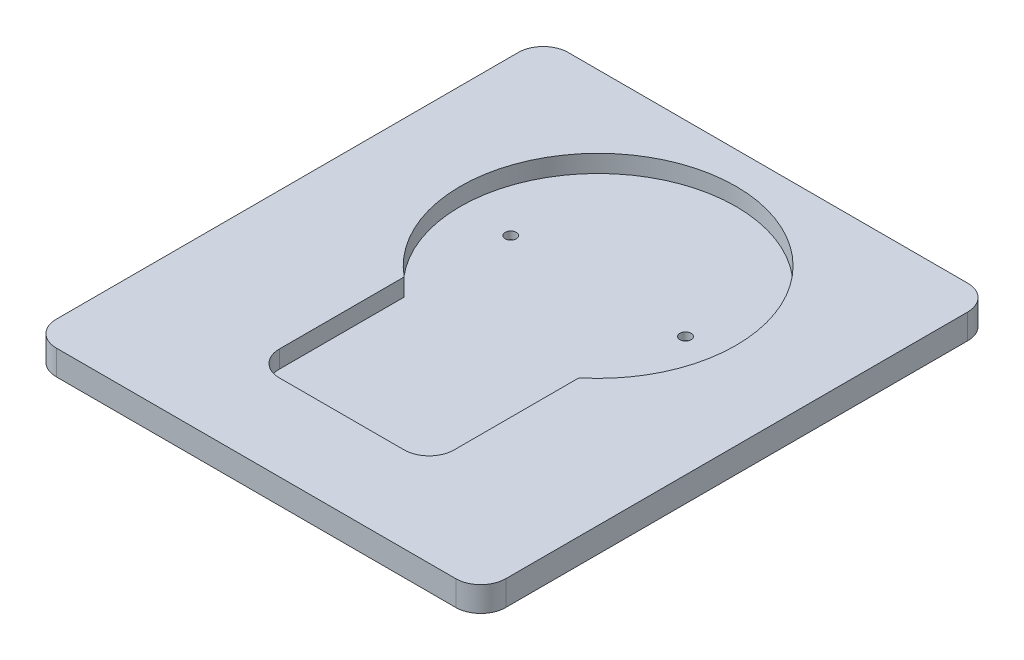
ISO-10303-21;
HEADER;
FILE_DESCRIPTION(('STEP AP214'),'2;1');
FILE_NAME('part.step','',(''),(''),'','','');
FILE_SCHEMA(('AUTOMOTIVE_DESIGN { 1 0 10303 214 1 1 1 1 }'));
ENDSEC;
DATA;
#1=APPLICATION_CONTEXT('core data for automotive mechanical design processes');
#2=APPLICATION_PROTOCOL_DEFINITION('international standard','automotive_design',2000,#1);
#3=PRODUCT_CONTEXT('',#1,'mechanical');
#4=PRODUCT('Part','Part','',(#3));
#5=PRODUCT_RELATED_PRODUCT_CATEGORY('part','',(#4));
#6=PRODUCT_DEFINITION_FORMATION('','',#4);
#7=PRODUCT_DEFINITION_CONTEXT('part definition',#1,'design');
#8=PRODUCT_DEFINITION('design','',#6,#7);
#9=PRODUCT_DEFINITION_SHAPE('','',#8);
#10=(LENGTH_UNIT() NAMED_UNIT(*) SI_UNIT(.MILLI.,.METRE.));
#11=(NAMED_UNIT(*) PLANE_ANGLE_UNIT() SI_UNIT($,.RADIAN.));
#12=(NAMED_UNIT(*) SI_UNIT($,.STERADIAN.) SOLID_ANGLE_UNIT());
#13=UNCERTAINTY_MEASURE_WITH_UNIT(LENGTH_MEASURE(1.E-05),#10,'distance_accuracy_value','');
#14=(GEOMETRIC_REPRESENTATION_CONTEXT(3) GLOBAL_UNCERTAINTY_ASSIGNED_CONTEXT((#13)) GLOBAL_UNIT_ASSIGNED_CONTEXT((#10,
#11,#12)) REPRESENTATION_CONTEXT('',''));
#15=CARTESIAN_POINT('',(0.,0.,0.));
#16=DIRECTION('',(0.,0.,1.));
#17=DIRECTION('',(1.,0.,0.));
#18=AXIS2_PLACEMENT_3D('',#15,#16,#17);
#19=CARTESIAN_POINT('',(80.,10.,-92.4999999999999));
#20=DIRECTION('',(0.,-1.,0.));
#21=DIRECTION('',(0.,0.,-1.));
#22=AXIS2_PLACEMENT_3D('',#19,#20,#21);
#23=CYLINDRICAL_SURFACE('',#22,10.);
#24=CARTESIAN_POINT('',(80.,0.,-92.4999999999999));
#25=DIRECTION('',(0.,1.,0.));
#26=DIRECTION('',(0.,0.,-1.));
#27=AXIS2_PLACEMENT_3D('',#24,#25,#26);
#28=CIRCLE('',#27,10.);
#29=CARTESIAN_POINT('',(90.,0.,-92.4999999999999));
#30=VERTEX_POINT('',#29);
#31=CARTESIAN_POINT('',(80.,0.,-102.5));
#32=VERTEX_POINT('',#31);
#33=EDGE_CURVE('E159',#30,#32,#28,.T.);
#34=ORIENTED_EDGE('',*,*,#33,.T.);
#35=DIRECTION('',(0.,-1.,0.));
#36=VECTOR('',#35,1.);
#37=CARTESIAN_POINT('',(80.,10.,-102.5));
#38=LINE('',#37,#36);
#39=CARTESIAN_POINT('',(80.,10.,-102.5));
#40=VERTEX_POINT('',#39);
#41=EDGE_CURVE('E11',#40,#32,#38,.T.);
#42=ORIENTED_EDGE('',*,*,#41,.F.);
#43=CARTESIAN_POINT('',(80.,10.,-92.4999999999999));
#44=DIRECTION('',(0.,1.,0.));
#45=DIRECTION('',(0.,0.,-1.));
#46=AXIS2_PLACEMENT_3D('',#43,#44,#45);
#47=CIRCLE('',#46,10.);
#48=CARTESIAN_POINT('',(90.,10.,-92.4999999999999));
#49=VERTEX_POINT('',#48);
#50=EDGE_CURVE('E183',#49,#40,#47,.T.);
#51=ORIENTED_EDGE('',*,*,#50,.F.);
#52=DIRECTION('',(0.,-1.,0.));
#53=VECTOR('',#52,1.);
#54=CARTESIAN_POINT('',(90.,10.,-92.4999999999999));
#55=LINE('',#54,#53);
#56=EDGE_CURVE('E155',#49,#30,#55,.T.);
#57=ORIENTED_EDGE('',*,*,#56,.T.);
#58=EDGE_LOOP('',(#34,#42,#51,#57));
#59=FACE_BOUND('',#58,.T.);
#60=ADVANCED_FACE('F43',(#59),#23,.T.);
#61=CARTESIAN_POINT('',(-80.,10.,-102.5));
#62=DIRECTION('',(0.,0.,1.));
#63=DIRECTION('',(1.,0.,0.));
#64=AXIS2_PLACEMENT_3D('',#61,#62,#63);
#65=PLANE('',#64);
#66=DIRECTION('',(-1.,0.,0.));
#67=VECTOR('',#66,1.);
#68=CARTESIAN_POINT('',(-80.,0.,-102.5));
#69=LINE('',#68,#67);
#70=CARTESIAN_POINT('',(-80.,0.,-102.5));
#71=VERTEX_POINT('',#70);
#72=EDGE_CURVE('E163',#32,#71,#69,.T.);
#73=ORIENTED_EDGE('',*,*,#72,.T.);
#74=DIRECTION('',(0.,-1.,0.));
#75=VECTOR('',#74,1.);
#76=CARTESIAN_POINT('',(-80.,10.,-102.5));
#77=LINE('',#76,#75);
#78=CARTESIAN_POINT('',(-80.,10.,-102.5));
#79=VERTEX_POINT('',#78);
#80=EDGE_CURVE('E52',#79,#71,#77,.T.);
#81=ORIENTED_EDGE('',*,*,#80,.F.);
#82=DIRECTION('',(-1.,0.,0.));
#83=VECTOR('',#82,1.);
#84=CARTESIAN_POINT('',(-80.,10.,-102.5));
#85=LINE('',#84,#83);
#86=EDGE_CURVE('E110',#40,#79,#85,.T.);
#87=ORIENTED_EDGE('',*,*,#86,.F.);
#88=ORIENTED_EDGE('',*,*,#41,.T.);
#89=EDGE_LOOP('',(#73,#81,#87,#88));
#90=FACE_BOUND('',#89,.T.);
#91=ADVANCED_FACE('F486',(#90),#65,.F.);
#92=CARTESIAN_POINT('',(-80.,10.,-92.4999999999999));
#93=DIRECTION('',(0.,-1.,0.));
#94=DIRECTION('',(0.,0.,-1.));
#95=AXIS2_PLACEMENT_3D('',#92,#93,#94);
#96=CYLINDRICAL_SURFACE('',#95,10.);
#97=CARTESIAN_POINT('',(-80.,0.,-92.4999999999999));
#98=DIRECTION('',(0.,1.,0.));
#99=DIRECTION('',(0.,0.,1.));
#100=AXIS2_PLACEMENT_3D('',#97,#98,#99);
#101=CIRCLE('',#100,10.);
#102=CARTESIAN_POINT('',(-90.,0.,-92.4999999999999));
#103=VERTEX_POINT('',#102);
#104=EDGE_CURVE('E167',#71,#103,#101,.T.);
#105=ORIENTED_EDGE('',*,*,#104,.T.);
#106=DIRECTION('',(0.,-1.,0.));
#107=VECTOR('',#106,1.);
#108=CARTESIAN_POINT('',(-90.,10.,-92.4999999999999));
#109=LINE('',#108,#107);
#110=CARTESIAN_POINT('',(-90.,10.,-92.4999999999999));
#111=VERTEX_POINT('',#110);
#112=EDGE_CURVE('E194',#111,#103,#109,.T.);
#113=ORIENTED_EDGE('',*,*,#112,.F.);
#114=CARTESIAN_POINT('',(-80.,10.,-92.4999999999999));
#115=DIRECTION('',(0.,1.,0.));
#116=DIRECTION('',(0.,0.,1.));
#117=AXIS2_PLACEMENT_3D('',#114,#115,#116);
#118=CIRCLE('',#117,10.);
#119=EDGE_CURVE('E290',#79,#111,#118,.T.);
#120=ORIENTED_EDGE('',*,*,#119,.F.);
#121=ORIENTED_EDGE('',*,*,#80,.T.);
#122=EDGE_LOOP('',(#105,#113,#120,#121));
#123=FACE_BOUND('',#122,.T.);
#124=ADVANCED_FACE('F478',(#123),#96,.T.);
#125=CARTESIAN_POINT('',(-90.,10.,-92.4999999999999));
#126=DIRECTION('',(1.,0.,0.));
#127=DIRECTION('',(0.,0.,-1.));
#128=AXIS2_PLACEMENT_3D('',#125,#126,#127);
#129=PLANE('',#128);
#130=DIRECTION('',(0.,0.,1.));
#131=VECTOR('',#130,1.);
#132=CARTESIAN_POINT('',(-90.,0.,-92.4999999999999));
#133=LINE('',#132,#131);
#134=CARTESIAN_POINT('',(-89.9999999999999,0.,92.5));
#135=VERTEX_POINT('',#134);
#136=EDGE_CURVE('E170',#103,#135,#133,.T.);
#137=ORIENTED_EDGE('',*,*,#136,.T.);
#138=DIRECTION('',(0.,-1.,0.));
#139=VECTOR('',#138,1.);
#140=CARTESIAN_POINT('',(-89.9999999999999,10.,92.5));
#141=LINE('',#140,#139);
#142=CARTESIAN_POINT('',(-89.9999999999999,10.,92.5));
#143=VERTEX_POINT('',#142);
#144=EDGE_CURVE('E190',#143,#135,#141,.T.);
#145=ORIENTED_EDGE('',*,*,#144,.F.);
#146=DIRECTION('',(0.,0.,1.));
#147=VECTOR('',#146,1.);
#148=CARTESIAN_POINT('',(-90.,10.,-92.4999999999999));
#149=LINE('',#148,#147);
#150=EDGE_CURVE('E293',#111,#143,#149,.T.);
#151=ORIENTED_EDGE('',*,*,#150,.F.);
#152=ORIENTED_EDGE('',*,*,#112,.T.);
#153=EDGE_LOOP('',(#137,#145,#151,#152));
#154=FACE_BOUND('',#153,.T.);
#155=ADVANCED_FACE('F470',(#154),#129,.F.);
#156=CARTESIAN_POINT('',(-80.,10.,92.5));
#157=DIRECTION('',(0.,-1.,0.));
#158=DIRECTION('',(0.,0.,-1.));
#159=AXIS2_PLACEMENT_3D('',#156,#157,#158);
#160=CYLINDRICAL_SURFACE('',#159,9.99999999999999);
#161=CARTESIAN_POINT('',(-80.,0.,92.5));
#162=DIRECTION('',(0.,1.,0.));
#163=DIRECTION('',(0.,0.,1.));
#164=AXIS2_PLACEMENT_3D('',#161,#162,#163);
#165=CIRCLE('',#164,9.99999999999999);
#166=CARTESIAN_POINT('',(-80.,0.,102.5));
#167=VERTEX_POINT('',#166);
#168=EDGE_CURVE('E173',#135,#167,#165,.T.);
#169=ORIENTED_EDGE('',*,*,#168,.T.);
#170=DIRECTION('',(0.,-1.,0.));
#171=VECTOR('',#170,1.);
#172=CARTESIAN_POINT('',(-80.,10.,102.5));
#173=LINE('',#172,#171);
#174=CARTESIAN_POINT('',(-80.,10.,102.5));
#175=VERTEX_POINT('',#174);
#176=EDGE_CURVE('E147',#175,#167,#173,.T.);
#177=ORIENTED_EDGE('',*,*,#176,.F.);
#178=CARTESIAN_POINT('',(-80.,10.,92.5));
#179=DIRECTION('',(0.,1.,0.));
#180=DIRECTION('',(0.,0.,1.));
#181=AXIS2_PLACEMENT_3D('',#178,#179,#180);
#182=CIRCLE('',#181,9.99999999999999);
#183=EDGE_CURVE('E133',#143,#175,#182,.T.);
#184=ORIENTED_EDGE('',*,*,#183,.F.);
#185=ORIENTED_EDGE('',*,*,#144,.T.);
#186=EDGE_LOOP('',(#169,#177,#184,#185));
#187=FACE_BOUND('',#186,.T.);
#188=ADVANCED_FACE('F463',(#187),#160,.T.);
#189=CARTESIAN_POINT('',(-80.,10.,102.5));
#190=DIRECTION('',(0.,0.,-1.));
#191=DIRECTION('',(-1.,0.,0.));
#192=AXIS2_PLACEMENT_3D('',#189,#190,#191);
#193=PLANE('',#192);
#194=DIRECTION('',(1.,0.,0.));
#195=VECTOR('',#194,1.);
#196=CARTESIAN_POINT('',(-80.,0.,102.5));
#197=LINE('',#196,#195);
#198=CARTESIAN_POINT('',(80.,0.,102.5));
#199=VERTEX_POINT('',#198);
#200=EDGE_CURVE('E143',#167,#199,#197,.T.);
#201=ORIENTED_EDGE('',*,*,#200,.T.);
#202=DIRECTION('',(0.,-1.,0.));
#203=VECTOR('',#202,1.);
#204=CARTESIAN_POINT('',(80.,10.,102.5));
#205=LINE('',#204,#203);
#206=CARTESIAN_POINT('',(80.,10.,102.5));
#207=VERTEX_POINT('',#206);
#208=EDGE_CURVE('E140',#207,#199,#205,.T.);
#209=ORIENTED_EDGE('',*,*,#208,.F.);
#210=DIRECTION('',(1.,0.,0.));
#211=VECTOR('',#210,1.);
#212=CARTESIAN_POINT('',(-80.,10.,102.5));
#213=LINE('',#212,#211);
#214=EDGE_CURVE('E126',#175,#207,#213,.T.);
#215=ORIENTED_EDGE('',*,*,#214,.F.);
#216=ORIENTED_EDGE('',*,*,#176,.T.);
#217=EDGE_LOOP('',(#201,#209,#215,#216));
#218=FACE_BOUND('',#217,.T.);
#219=ADVANCED_FACE('F141',(#218),#193,.F.);
#220=CARTESIAN_POINT('',(80.,10.,92.5));
#221=DIRECTION('',(0.,-1.,0.));
#222=DIRECTION('',(0.,0.,-1.));
#223=AXIS2_PLACEMENT_3D('',#220,#221,#222);
#224=CYLINDRICAL_SURFACE('',#223,10.);
#225=CARTESIAN_POINT('',(80.,0.,92.5));
#226=DIRECTION('',(0.,1.,0.));
#227=DIRECTION('',(0.,0.,1.));
#228=AXIS2_PLACEMENT_3D('',#225,#226,#227);
#229=CIRCLE('',#228,10.);
#230=CARTESIAN_POINT('',(90.,0.,92.5));
#231=VERTEX_POINT('',#230);
#232=EDGE_CURVE('E178',#199,#231,#229,.T.);
#233=ORIENTED_EDGE('',*,*,#232,.T.);
#234=DIRECTION('',(0.,-1.,0.));
#235=VECTOR('',#234,1.);
#236=CARTESIAN_POINT('',(90.,10.,92.5));
#237=LINE('',#236,#235);
#238=CARTESIAN_POINT('',(90.,10.,92.5));
#239=VERTEX_POINT('',#238);
#240=EDGE_CURVE('E148',#239,#231,#237,.T.);
#241=ORIENTED_EDGE('',*,*,#240,.F.);
#242=CARTESIAN_POINT('',(80.,10.,92.5));
#243=DIRECTION('',(0.,1.,0.));
#244=DIRECTION('',(0.,0.,1.));
#245=AXIS2_PLACEMENT_3D('',#242,#243,#244);
#246=CIRCLE('',#245,10.);
#247=EDGE_CURVE('E130',#207,#239,#246,.T.);
#248=ORIENTED_EDGE('',*,*,#247,.F.);
#249=ORIENTED_EDGE('',*,*,#208,.T.);
#250=EDGE_LOOP('',(#233,#241,#248,#249));
#251=FACE_BOUND('',#250,.T.);
#252=ADVANCED_FACE('F150',(#251),#224,.T.);
#253=CARTESIAN_POINT('',(90.,10.,-92.4999999999999));
#254=DIRECTION('',(-1.,0.,0.));
#255=DIRECTION('',(0.,0.,1.));
#256=AXIS2_PLACEMENT_3D('',#253,#254,#255);
#257=PLANE('',#256);
#258=DIRECTION('',(0.,0.,-1.));
#259=VECTOR('',#258,1.);
#260=CARTESIAN_POINT('',(90.,0.,-92.4999999999999));
#261=LINE('',#260,#259);
#262=EDGE_CURVE('E102',#231,#30,#261,.T.);
#263=ORIENTED_EDGE('',*,*,#262,.T.);
#264=ORIENTED_EDGE('',*,*,#56,.F.);
#265=DIRECTION('',(0.,0.,-1.));
#266=VECTOR('',#265,1.);
#267=CARTESIAN_POINT('',(90.,10.,-92.4999999999999));
#268=LINE('',#267,#266);
#269=EDGE_CURVE('E69',#239,#49,#268,.T.);
#270=ORIENTED_EDGE('',*,*,#269,.F.);
#271=ORIENTED_EDGE('',*,*,#240,.T.);
#272=EDGE_LOOP('',(#263,#264,#270,#271));
#273=FACE_BOUND('',#272,.T.);
#274=ADVANCED_FACE('F366',(#273),#257,.F.);
#275=CARTESIAN_POINT('',(80.,10.,-92.4999999999999));
#276=DIRECTION('',(0.,-1.,0.));
#277=DIRECTION('',(0.,0.,-1.));
#278=AXIS2_PLACEMENT_3D('',#275,#276,#277);
#279=PLANE('',#278);
#280=DIRECTION('',(0.,0.,1.));
#281=VECTOR('',#280,1.);
#282=CARTESIAN_POINT('',(-35.,10.,8.18536048811117));
#283=LINE('',#282,#281);
#284=CARTESIAN_POINT('',(-35.,10.,8.18536048811117));
#285=VERTEX_POINT('',#284);
#286=CARTESIAN_POINT('',(-35.,10.,58.1853604881112));
#287=VERTEX_POINT('',#286);
#288=EDGE_CURVE('E210',#285,#287,#283,.T.);
#289=ORIENTED_EDGE('',*,*,#288,.F.);
#290=CARTESIAN_POINT('',(0.,10.,-34.5));
#291=DIRECTION('',(0.,1.,0.));
#292=DIRECTION('',(0.,0.,1.));
#293=AXIS2_PLACEMENT_3D('',#290,#291,#292);
#294=CIRCLE('',#293,55.2);
#295=CARTESIAN_POINT('',(35.,10.,8.18536048811116));
#296=VERTEX_POINT('',#295);
#297=EDGE_CURVE('E60',#296,#285,#294,.T.);
#298=ORIENTED_EDGE('',*,*,#297,.F.);
#299=DIRECTION('',(0.,0.,-1.));
#300=VECTOR('',#299,1.);
#301=CARTESIAN_POINT('',(35.,10.,8.18536048811116));
#302=LINE('',#301,#300);
#303=CARTESIAN_POINT('',(35.,10.,58.1853604881112));
#304=VERTEX_POINT('',#303);
#305=EDGE_CURVE('E227',#304,#296,#302,.T.);
#306=ORIENTED_EDGE('',*,*,#305,.F.);
#307=CARTESIAN_POINT('',(25.,10.,58.1853604881112));
#308=DIRECTION('',(0.,1.,0.));
#309=DIRECTION('',(0.,0.,1.));
#310=AXIS2_PLACEMENT_3D('',#307,#308,#309);
#311=CIRCLE('',#310,10.);
#312=CARTESIAN_POINT('',(25.,10.,68.1853604881112));
#313=VERTEX_POINT('',#312);
#314=EDGE_CURVE('E259',#313,#304,#311,.T.);
#315=ORIENTED_EDGE('',*,*,#314,.F.);
#316=DIRECTION('',(1.,0.,0.));
#317=VECTOR('',#316,1.);
#318=CARTESIAN_POINT('',(-25.,10.,68.1853604881112));
#319=LINE('',#318,#317);
#320=CARTESIAN_POINT('',(-25.,10.,68.1853604881112));
#321=VERTEX_POINT('',#320);
#322=EDGE_CURVE('E255',#321,#313,#319,.T.);
#323=ORIENTED_EDGE('',*,*,#322,.F.);
#324=CARTESIAN_POINT('',(-25.,10.,58.1853604881112));
#325=DIRECTION('',(0.,1.,0.));
#326=DIRECTION('',(0.,0.,1.));
#327=AXIS2_PLACEMENT_3D('',#324,#325,#326);
#328=CIRCLE('',#327,10.);
#329=EDGE_CURVE('E251',#287,#321,#328,.T.);
#330=ORIENTED_EDGE('',*,*,#329,.F.);
#331=EDGE_LOOP('',(#289,#298,#306,#315,#323,#330));
#332=FACE_BOUND('',#331,.T.);
#333=ORIENTED_EDGE('',*,*,#50,.T.);
#334=ORIENTED_EDGE('',*,*,#86,.T.);
#335=ORIENTED_EDGE('',*,*,#119,.T.);
#336=ORIENTED_EDGE('',*,*,#150,.T.);
#337=ORIENTED_EDGE('',*,*,#183,.T.);
#338=ORIENTED_EDGE('',*,*,#214,.T.);
#339=ORIENTED_EDGE('',*,*,#247,.T.);
#340=ORIENTED_EDGE('',*,*,#269,.T.);
#341=EDGE_LOOP('',(#333,#334,#335,#336,#337,#338,#339,#340));
#342=FACE_BOUND('',#341,.T.);
#343=ADVANCED_FACE('F128',(#332,#342),#279,.F.);
#344=CARTESIAN_POINT('',(80.,0.,-92.4999999999999));
#345=DIRECTION('',(0.,-1.,0.));
#346=DIRECTION('',(0.,0.,-1.));
#347=AXIS2_PLACEMENT_3D('',#344,#345,#346);
#348=PLANE('',#347);
#349=CARTESIAN_POINT('',(35.,0.,-34.5));
#350=DIRECTION('',(0.,-1.,0.));
#351=DIRECTION('',(0.,0.,-1.));
#352=AXIS2_PLACEMENT_3D('',#349,#350,#351);
#353=CIRCLE('',#352,2.24999999999999);
#354=CARTESIAN_POINT('',(35.,0.,-36.75));
#355=VERTEX_POINT('',#354);
#356=EDGE_CURVE('E219',#355,#355,#353,.T.);
#357=ORIENTED_EDGE('',*,*,#356,.F.);
#358=EDGE_LOOP('',(#357));
#359=FACE_BOUND('',#358,.T.);
#360=CARTESIAN_POINT('',(-35.,0.,-34.5));
#361=DIRECTION('',(0.,-1.,0.));
#362=DIRECTION('',(0.,0.,-1.));
#363=AXIS2_PLACEMENT_3D('',#360,#361,#362);
#364=CIRCLE('',#363,2.24999999999999);
#365=CARTESIAN_POINT('',(-35.,0.,-36.75));
#366=VERTEX_POINT('',#365);
#367=EDGE_CURVE('E203',#366,#366,#364,.T.);
#368=ORIENTED_EDGE('',*,*,#367,.F.);
#369=EDGE_LOOP('',(#368));
#370=FACE_BOUND('',#369,.T.);
#371=ORIENTED_EDGE('',*,*,#33,.F.);
#372=ORIENTED_EDGE('',*,*,#262,.F.);
#373=ORIENTED_EDGE('',*,*,#232,.F.);
#374=ORIENTED_EDGE('',*,*,#200,.F.);
#375=ORIENTED_EDGE('',*,*,#168,.F.);
#376=ORIENTED_EDGE('',*,*,#136,.F.);
#377=ORIENTED_EDGE('',*,*,#104,.F.);
#378=ORIENTED_EDGE('',*,*,#72,.F.);
#379=EDGE_LOOP('',(#371,#372,#373,#374,#375,#376,#377,#378));
#380=FACE_BOUND('',#379,.T.);
#381=ADVANCED_FACE('F365',(#359,#370,#380),#348,.T.);
#382=CARTESIAN_POINT('',(0.,3.,-34.5));
#383=DIRECTION('',(0.,1.,0.));
#384=DIRECTION('',(0.,0.,1.));
#385=AXIS2_PLACEMENT_3D('',#382,#383,#384);
#386=CYLINDRICAL_SURFACE('',#385,55.2);
#387=ORIENTED_EDGE('',*,*,#297,.T.);
#388=DIRECTION('',(0.,1.,0.));
#389=VECTOR('',#388,1.);
#390=CARTESIAN_POINT('',(-35.,3.,8.18536048811117));
#391=LINE('',#390,#389);
#392=CARTESIAN_POINT('',(-35.,3.,8.18536048811117));
#393=VERTEX_POINT('',#392);
#394=EDGE_CURVE('E246',#393,#285,#391,.T.);
#395=ORIENTED_EDGE('',*,*,#394,.F.);
#396=CARTESIAN_POINT('',(0.,3.,-34.5));
#397=DIRECTION('',(0.,1.,0.));
#398=DIRECTION('',(0.,0.,1.));
#399=AXIS2_PLACEMENT_3D('',#396,#397,#398);
#400=CIRCLE('',#399,55.2);
#401=CARTESIAN_POINT('',(35.,3.,8.18536048811116));
#402=VERTEX_POINT('',#401);
#403=EDGE_CURVE('E222',#402,#393,#400,.T.);
#404=ORIENTED_EDGE('',*,*,#403,.F.);
#405=DIRECTION('',(0.,1.,0.));
#406=VECTOR('',#405,1.);
#407=CARTESIAN_POINT('',(35.,3.,8.18536048811116));
#408=LINE('',#407,#406);
#409=EDGE_CURVE('E164',#402,#296,#408,.T.);
#410=ORIENTED_EDGE('',*,*,#409,.T.);
#411=EDGE_LOOP('',(#387,#395,#404,#410));
#412=FACE_BOUND('',#411,.T.);
#413=ADVANCED_FACE('F430',(#412),#386,.F.);
#414=CARTESIAN_POINT('',(35.,3.,8.18536048811116));
#415=DIRECTION('',(1.,0.,0.));
#416=DIRECTION('',(0.,0.,-1.));
#417=AXIS2_PLACEMENT_3D('',#414,#415,#416);
#418=PLANE('',#417);
#419=ORIENTED_EDGE('',*,*,#305,.T.);
#420=ORIENTED_EDGE('',*,*,#409,.F.);
#421=DIRECTION('',(0.,0.,-1.));
#422=VECTOR('',#421,1.);
#423=CARTESIAN_POINT('',(35.,3.,8.18536048811116));
#424=LINE('',#423,#422);
#425=CARTESIAN_POINT('',(35.,3.,58.1853604881112));
#426=VERTEX_POINT('',#425);
#427=EDGE_CURVE('E243',#426,#402,#424,.T.);
#428=ORIENTED_EDGE('',*,*,#427,.F.);
#429=DIRECTION('',(0.,1.,0.));
#430=VECTOR('',#429,1.);
#431=CARTESIAN_POINT('',(35.,3.,58.1853604881112));
#432=LINE('',#431,#430);
#433=EDGE_CURVE('E268',#426,#304,#432,.T.);
#434=ORIENTED_EDGE('',*,*,#433,.T.);
#435=EDGE_LOOP('',(#419,#420,#428,#434));
#436=FACE_BOUND('',#435,.T.);
#437=ADVANCED_FACE('F422',(#436),#418,.F.);
#438=CARTESIAN_POINT('',(25.,3.,58.1853604881112));
#439=DIRECTION('',(0.,1.,0.));
#440=DIRECTION('',(0.,0.,1.));
#441=AXIS2_PLACEMENT_3D('',#438,#439,#440);
#442=CYLINDRICAL_SURFACE('',#441,10.);
#443=ORIENTED_EDGE('',*,*,#314,.T.);
#444=ORIENTED_EDGE('',*,*,#433,.F.);
#445=CARTESIAN_POINT('',(25.,3.,58.1853604881112));
#446=DIRECTION('',(0.,1.,0.));
#447=DIRECTION('',(0.,0.,1.));
#448=AXIS2_PLACEMENT_3D('',#445,#446,#447);
#449=CIRCLE('',#448,10.);
#450=CARTESIAN_POINT('',(25.,3.,68.1853604881112));
#451=VERTEX_POINT('',#450);
#452=EDGE_CURVE('E239',#451,#426,#449,.T.);
#453=ORIENTED_EDGE('',*,*,#452,.F.);
#454=DIRECTION('',(0.,1.,0.));
#455=VECTOR('',#454,1.);
#456=CARTESIAN_POINT('',(25.,3.,68.1853604881112));
#457=LINE('',#456,#455);
#458=EDGE_CURVE('E272',#451,#313,#457,.T.);
#459=ORIENTED_EDGE('',*,*,#458,.T.);
#460=EDGE_LOOP('',(#443,#444,#453,#459));
#461=FACE_BOUND('',#460,.T.);
#462=ADVANCED_FACE('F414',(#461),#442,.F.);
#463=CARTESIAN_POINT('',(-25.,3.,68.1853604881112));
#464=DIRECTION('',(0.,0.,1.));
#465=DIRECTION('',(1.,0.,0.));
#466=AXIS2_PLACEMENT_3D('',#463,#464,#465);
#467=PLANE('',#466);
#468=ORIENTED_EDGE('',*,*,#322,.T.);
#469=ORIENTED_EDGE('',*,*,#458,.F.);
#470=DIRECTION('',(1.,0.,0.));
#471=VECTOR('',#470,1.);
#472=CARTESIAN_POINT('',(-25.,3.,68.1853604881112));
#473=LINE('',#472,#471);
#474=CARTESIAN_POINT('',(-25.,3.,68.1853604881112));
#475=VERTEX_POINT('',#474);
#476=EDGE_CURVE('E235',#475,#451,#473,.T.);
#477=ORIENTED_EDGE('',*,*,#476,.F.);
#478=DIRECTION('',(0.,1.,0.));
#479=VECTOR('',#478,1.);
#480=CARTESIAN_POINT('',(-25.,3.,68.1853604881112));
#481=LINE('',#480,#479);
#482=EDGE_CURVE('E276',#475,#321,#481,.T.);
#483=ORIENTED_EDGE('',*,*,#482,.T.);
#484=EDGE_LOOP('',(#468,#469,#477,#483));
#485=FACE_BOUND('',#484,.T.);
#486=ADVANCED_FACE('F406',(#485),#467,.F.);
#487=CARTESIAN_POINT('',(-25.,3.,58.1853604881112));
#488=DIRECTION('',(0.,1.,0.));
#489=DIRECTION('',(0.,0.,1.));
#490=AXIS2_PLACEMENT_3D('',#487,#488,#489);
#491=CYLINDRICAL_SURFACE('',#490,10.);
#492=ORIENTED_EDGE('',*,*,#329,.T.);
#493=ORIENTED_EDGE('',*,*,#482,.F.);
#494=CARTESIAN_POINT('',(-25.,3.,58.1853604881112));
#495=DIRECTION('',(0.,1.,0.));
#496=DIRECTION('',(0.,0.,1.));
#497=AXIS2_PLACEMENT_3D('',#494,#495,#496);
#498=CIRCLE('',#497,10.);
#499=CARTESIAN_POINT('',(-35.,3.,58.1853604881112));
#500=VERTEX_POINT('',#499);
#501=EDGE_CURVE('E231',#500,#475,#498,.T.);
#502=ORIENTED_EDGE('',*,*,#501,.F.);
#503=DIRECTION('',(0.,1.,0.));
#504=VECTOR('',#503,1.);
#505=CARTESIAN_POINT('',(-35.,3.,58.1853604881112));
#506=LINE('',#505,#504);
#507=EDGE_CURVE('E280',#500,#287,#506,.T.);
#508=ORIENTED_EDGE('',*,*,#507,.T.);
#509=EDGE_LOOP('',(#492,#493,#502,#508));
#510=FACE_BOUND('',#509,.T.);
#511=ADVANCED_FACE('F398',(#510),#491,.F.);
#512=CARTESIAN_POINT('',(-35.,3.,8.18536048811117));
#513=DIRECTION('',(-1.,0.,0.));
#514=DIRECTION('',(0.,0.,1.));
#515=AXIS2_PLACEMENT_3D('',#512,#513,#514);
#516=PLANE('',#515);
#517=ORIENTED_EDGE('',*,*,#288,.T.);
#518=ORIENTED_EDGE('',*,*,#507,.F.);
#519=DIRECTION('',(0.,0.,1.));
#520=VECTOR('',#519,1.);
#521=CARTESIAN_POINT('',(-35.,3.,8.18536048811117));
#522=LINE('',#521,#520);
#523=EDGE_CURVE('E226',#393,#500,#522,.T.);
#524=ORIENTED_EDGE('',*,*,#523,.F.);
#525=ORIENTED_EDGE('',*,*,#394,.T.);
#526=EDGE_LOOP('',(#517,#518,#524,#525));
#527=FACE_BOUND('',#526,.T.);
#528=ADVANCED_FACE('F394',(#527),#516,.F.);
#529=CARTESIAN_POINT('',(0.,3.,-34.5));
#530=DIRECTION('',(0.,1.,0.));
#531=DIRECTION('',(0.,0.,1.));
#532=AXIS2_PLACEMENT_3D('',#529,#530,#531);
#533=PLANE('',#532);
#534=CARTESIAN_POINT('',(35.,3.,-34.5));
#535=DIRECTION('',(0.,1.,0.));
#536=DIRECTION('',(0.,0.,1.));
#537=AXIS2_PLACEMENT_3D('',#534,#535,#536);
#538=CIRCLE('',#537,2.24999999999999);
#539=CARTESIAN_POINT('',(35.,3.,-32.25));
#540=VERTEX_POINT('',#539);
#541=EDGE_CURVE('E46',#540,#540,#538,.T.);
#542=ORIENTED_EDGE('',*,*,#541,.F.);
#543=EDGE_LOOP('',(#542));
#544=FACE_BOUND('',#543,.T.);
#545=CARTESIAN_POINT('',(-35.,3.,-34.5));
#546=DIRECTION('',(0.,1.,0.));
#547=DIRECTION('',(0.,0.,1.));
#548=AXIS2_PLACEMENT_3D('',#545,#546,#547);
#549=CIRCLE('',#548,2.24999999999999);
#550=CARTESIAN_POINT('',(-35.,3.,-32.25));
#551=VERTEX_POINT('',#550);
#552=EDGE_CURVE('E200',#551,#551,#549,.T.);
#553=ORIENTED_EDGE('',*,*,#552,.F.);
#554=EDGE_LOOP('',(#553));
#555=FACE_BOUND('',#554,.T.);
#556=ORIENTED_EDGE('',*,*,#403,.T.);
#557=ORIENTED_EDGE('',*,*,#523,.T.);
#558=ORIENTED_EDGE('',*,*,#501,.T.);
#559=ORIENTED_EDGE('',*,*,#476,.T.);
#560=ORIENTED_EDGE('',*,*,#452,.T.);
#561=ORIENTED_EDGE('',*,*,#427,.T.);
#562=EDGE_LOOP('',(#556,#557,#558,#559,#560,#561));
#563=FACE_BOUND('',#562,.T.);
#564=ADVANCED_FACE('F389',(#544,#555,#563),#533,.T.);
#565=CARTESIAN_POINT('',(-35.,0.,-34.5));
#566=DIRECTION('',(0.,-1.,0.));
#567=DIRECTION('',(0.,0.,-1.));
#568=AXIS2_PLACEMENT_3D('',#565,#566,#567);
#569=CYLINDRICAL_SURFACE('',#568,2.24999999999999);
#570=ORIENTED_EDGE('',*,*,#552,.T.);
#571=EDGE_LOOP('',(#570));
#572=FACE_BOUND('',#571,.T.);
#573=ORIENTED_EDGE('',*,*,#367,.T.);
#574=EDGE_LOOP('',(#573));
#575=FACE_BOUND('',#574,.T.);
#576=ADVANCED_FACE('F381',(#572,#575),#569,.F.);
#577=CARTESIAN_POINT('',(35.,0.,-34.5));
#578=DIRECTION('',(0.,-1.,0.));
#579=DIRECTION('',(0.,0.,-1.));
#580=AXIS2_PLACEMENT_3D('',#577,#578,#579);
#581=CYLINDRICAL_SURFACE('',#580,2.24999999999999);
#582=ORIENTED_EDGE('',*,*,#541,.T.);
#583=EDGE_LOOP('',(#582));
#584=FACE_BOUND('',#583,.T.);
#585=ORIENTED_EDGE('',*,*,#356,.T.);
#586=EDGE_LOOP('',(#585));
#587=FACE_BOUND('',#586,.T.);
#588=ADVANCED_FACE('F378',(#584,#587),#581,.F.);
#589=CLOSED_SHELL('',(#60,#91,#124,#155,#188,#219,#252,#274,#343,#381,#413,#437,#462,#486,#511,
#528,#564,#576,#588));
#590=MANIFOLD_SOLID_BREP('B2',#589);
#591=ADVANCED_BREP_SHAPE_REPRESENTATION('',(#18,#590),#14);
#592=SHAPE_DEFINITION_REPRESENTATION(#9,#591);
ENDSEC;
END-ISO-10303-21;
